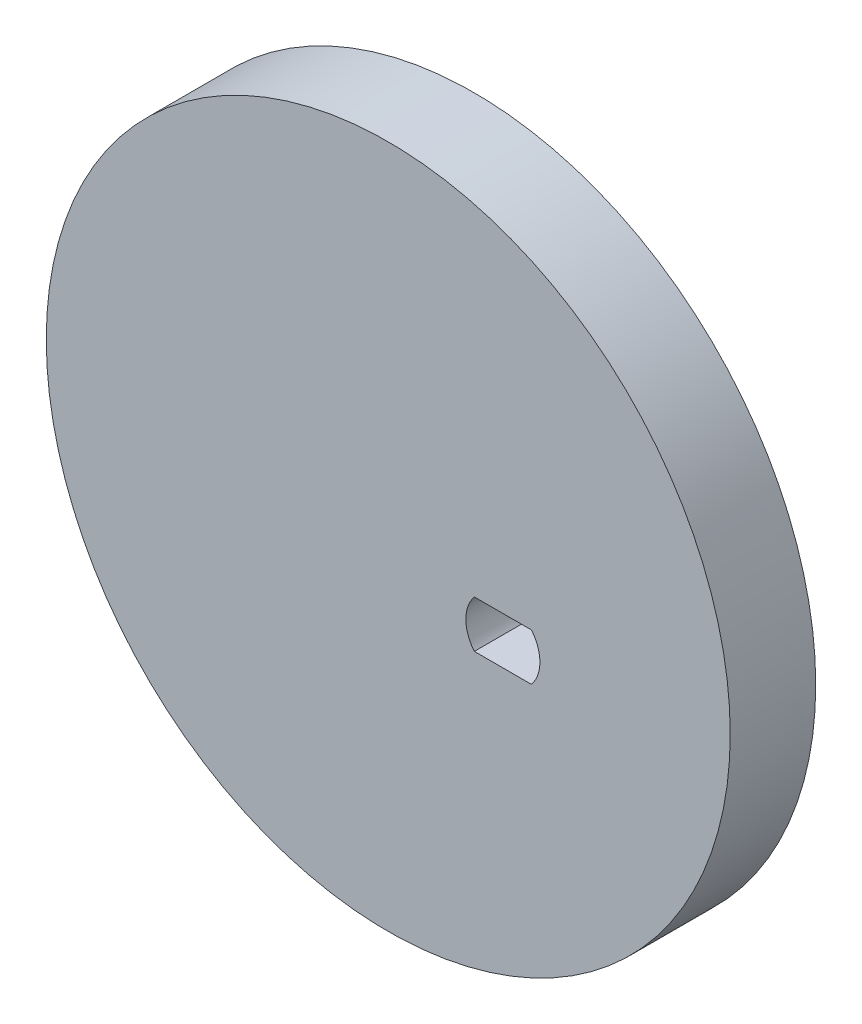
ISO-10303-21;
HEADER;
FILE_DESCRIPTION(('STEP AP214'),'2;1');
FILE_NAME('part.step','',(''),(''),'','','');
FILE_SCHEMA(('AUTOMOTIVE_DESIGN { 1 0 10303 214 1 1 1 1 }'));
ENDSEC;
DATA;
#1=APPLICATION_CONTEXT('core data for automotive mechanical design processes');
#2=APPLICATION_PROTOCOL_DEFINITION('international standard','automotive_design',2000,#1);
#3=PRODUCT_CONTEXT('',#1,'mechanical');
#4=PRODUCT('Part','Part','',(#3));
#5=PRODUCT_RELATED_PRODUCT_CATEGORY('part','',(#4));
#6=PRODUCT_DEFINITION_FORMATION('','',#4);
#7=PRODUCT_DEFINITION_CONTEXT('part definition',#1,'design');
#8=PRODUCT_DEFINITION('design','',#6,#7);
#9=PRODUCT_DEFINITION_SHAPE('','',#8);
#10=(LENGTH_UNIT() NAMED_UNIT(*) SI_UNIT(.MILLI.,.METRE.));
#11=(NAMED_UNIT(*) PLANE_ANGLE_UNIT() SI_UNIT($,.RADIAN.));
#12=(NAMED_UNIT(*) SI_UNIT($,.STERADIAN.) SOLID_ANGLE_UNIT());
#13=UNCERTAINTY_MEASURE_WITH_UNIT(LENGTH_MEASURE(1.E-05),#10,'distance_accuracy_value','');
#14=(GEOMETRIC_REPRESENTATION_CONTEXT(3) GLOBAL_UNCERTAINTY_ASSIGNED_CONTEXT((#13)) GLOBAL_UNIT_ASSIGNED_CONTEXT((#10,
#11,#12)) REPRESENTATION_CONTEXT('',''));
#15=CARTESIAN_POINT('',(0.,0.,0.));
#16=DIRECTION('',(0.,0.,1.));
#17=DIRECTION('',(1.,0.,0.));
#18=AXIS2_PLACEMENT_3D('',#15,#16,#17);
#19=CARTESIAN_POINT('',(-8.51465388188488,2.43047333481311,6.35));
#20=DIRECTION('',(0.,0.,1.));
#21=DIRECTION('',(1.,0.,0.));
#22=AXIS2_PLACEMENT_3D('',#19,#20,#21);
#23=PLANE('',#22);
#24=CARTESIAN_POINT('',(-8.51465388188488,2.43047333481311,6.35));
#25=DIRECTION('',(0.,0.,1.));
#26=DIRECTION('',(1.,0.,0.));
#27=AXIS2_PLACEMENT_3D('',#24,#25,#26);
#28=CIRCLE('',#27,25.4);
#29=CARTESIAN_POINT('',(16.8853461181151,2.43047333481311,6.35));
#30=VERTEX_POINT('',#29);
#31=EDGE_CURVE('E11',#30,#30,#28,.T.);
#32=ORIENTED_EDGE('',*,*,#31,.T.);
#33=EDGE_LOOP('',(#32));
#34=FACE_BOUND('',#33,.T.);
#35=DIRECTION('',(1.,0.,0.));
#36=VECTOR('',#35,1.);
#37=CARTESIAN_POINT('',(-2.12132034355964,-1.75,6.35));
#38=LINE('',#37,#36);
#39=CARTESIAN_POINT('',(-2.12132034355964,-1.75,6.35));
#40=VERTEX_POINT('',#39);
#41=CARTESIAN_POINT('',(2.12132034355964,-1.75,6.35));
#42=VERTEX_POINT('',#41);
#43=EDGE_CURVE('E88',#40,#42,#38,.T.);
#44=ORIENTED_EDGE('',*,*,#43,.F.);
#45=CARTESIAN_POINT('',(0.,0.,6.35));
#46=DIRECTION('',(0.,0.,1.));
#47=DIRECTION('',(1.,0.,0.));
#48=AXIS2_PLACEMENT_3D('',#45,#46,#47);
#49=CIRCLE('',#48,2.75);
#50=CARTESIAN_POINT('',(-2.12132034355964,1.75,6.35));
#51=VERTEX_POINT('',#50);
#52=EDGE_CURVE('E80',#51,#40,#49,.T.);
#53=ORIENTED_EDGE('',*,*,#52,.F.);
#54=DIRECTION('',(-1.,0.,0.));
#55=VECTOR('',#54,1.);
#56=CARTESIAN_POINT('',(-2.12132034355964,1.75,6.35));
#57=LINE('',#56,#55);
#58=CARTESIAN_POINT('',(2.12132034355964,1.75,6.35));
#59=VERTEX_POINT('',#58);
#60=EDGE_CURVE('E101',#59,#51,#57,.T.);
#61=ORIENTED_EDGE('',*,*,#60,.F.);
#62=CARTESIAN_POINT('',(0.,0.,6.35));
#63=DIRECTION('',(0.,0.,1.));
#64=DIRECTION('',(-1.,0.,0.));
#65=AXIS2_PLACEMENT_3D('',#62,#63,#64);
#66=CIRCLE('',#65,2.75);
#67=EDGE_CURVE('E99',#42,#59,#66,.T.);
#68=ORIENTED_EDGE('',*,*,#67,.F.);
#69=EDGE_LOOP('',(#44,#53,#61,#68));
#70=FACE_BOUND('',#69,.T.);
#71=ADVANCED_FACE('F39',(#34,#70),#23,.T.);
#72=CARTESIAN_POINT('',(-8.51465388188488,2.43047333481311,0.));
#73=DIRECTION('',(0.,0.,1.));
#74=DIRECTION('',(1.,0.,0.));
#75=AXIS2_PLACEMENT_3D('',#72,#73,#74);
#76=PLANE('',#75);
#77=CARTESIAN_POINT('',(-8.51465388188488,2.43047333481311,0.));
#78=DIRECTION('',(0.,0.,1.));
#79=DIRECTION('',(1.,0.,0.));
#80=AXIS2_PLACEMENT_3D('',#77,#78,#79);
#81=CIRCLE('',#80,25.4);
#82=CARTESIAN_POINT('',(16.8853461181151,2.43047333481311,0.));
#83=VERTEX_POINT('',#82);
#84=EDGE_CURVE('E43',#83,#83,#81,.T.);
#85=ORIENTED_EDGE('',*,*,#84,.F.);
#86=EDGE_LOOP('',(#85));
#87=FACE_BOUND('',#86,.T.);
#88=CARTESIAN_POINT('',(0.,0.,0.));
#89=DIRECTION('',(0.,0.,1.));
#90=DIRECTION('',(1.,0.,0.));
#91=AXIS2_PLACEMENT_3D('',#88,#89,#90);
#92=CIRCLE('',#91,2.75);
#93=CARTESIAN_POINT('',(-2.12132034355964,1.75,0.));
#94=VERTEX_POINT('',#93);
#95=CARTESIAN_POINT('',(-2.12132034355964,-1.75,0.));
#96=VERTEX_POINT('',#95);
#97=EDGE_CURVE('E62',#94,#96,#92,.T.);
#98=ORIENTED_EDGE('',*,*,#97,.T.);
#99=DIRECTION('',(1.,0.,0.));
#100=VECTOR('',#99,1.);
#101=CARTESIAN_POINT('',(-2.12132034355964,-1.75,0.));
#102=LINE('',#101,#100);
#103=CARTESIAN_POINT('',(2.12132034355964,-1.75,0.));
#104=VERTEX_POINT('',#103);
#105=EDGE_CURVE('E95',#96,#104,#102,.T.);
#106=ORIENTED_EDGE('',*,*,#105,.T.);
#107=CARTESIAN_POINT('',(0.,0.,0.));
#108=DIRECTION('',(0.,0.,1.));
#109=DIRECTION('',(-1.,0.,0.));
#110=AXIS2_PLACEMENT_3D('',#107,#108,#109);
#111=CIRCLE('',#110,2.75);
#112=CARTESIAN_POINT('',(2.12132034355964,1.75,0.));
#113=VERTEX_POINT('',#112);
#114=EDGE_CURVE('E107',#104,#113,#111,.T.);
#115=ORIENTED_EDGE('',*,*,#114,.T.);
#116=DIRECTION('',(-1.,0.,0.));
#117=VECTOR('',#116,1.);
#118=CARTESIAN_POINT('',(-2.12132034355964,1.75,0.));
#119=LINE('',#118,#117);
#120=EDGE_CURVE('E89',#113,#94,#119,.T.);
#121=ORIENTED_EDGE('',*,*,#120,.T.);
#122=EDGE_LOOP('',(#98,#106,#115,#121));
#123=FACE_BOUND('',#122,.T.);
#124=ADVANCED_FACE('F118',(#87,#123),#76,.F.);
#125=CARTESIAN_POINT('',(-8.51465388188488,2.43047333481311,6.35));
#126=DIRECTION('',(0.,0.,-1.));
#127=DIRECTION('',(-1.,0.,0.));
#128=AXIS2_PLACEMENT_3D('',#125,#126,#127);
#129=CYLINDRICAL_SURFACE('',#128,25.4);
#130=ORIENTED_EDGE('',*,*,#31,.F.);
#131=EDGE_LOOP('',(#130));
#132=FACE_BOUND('',#131,.T.);
#133=ORIENTED_EDGE('',*,*,#84,.T.);
#134=EDGE_LOOP('',(#133));
#135=FACE_BOUND('',#134,.T.);
#136=ADVANCED_FACE('F41',(#132,#135),#129,.T.);
#137=CARTESIAN_POINT('',(0.,0.,6.35));
#138=DIRECTION('',(0.,0.,-1.));
#139=DIRECTION('',(-1.,0.,0.));
#140=AXIS2_PLACEMENT_3D('',#137,#138,#139);
#141=CYLINDRICAL_SURFACE('',#140,2.75);
#142=ORIENTED_EDGE('',*,*,#97,.F.);
#143=DIRECTION('',(0.,0.,-1.));
#144=VECTOR('',#143,1.);
#145=CARTESIAN_POINT('',(-2.12132034355964,1.75,6.35));
#146=LINE('',#145,#144);
#147=EDGE_CURVE('E84',#51,#94,#146,.T.);
#148=ORIENTED_EDGE('',*,*,#147,.F.);
#149=ORIENTED_EDGE('',*,*,#52,.T.);
#150=DIRECTION('',(0.,0.,-1.));
#151=VECTOR('',#150,1.);
#152=CARTESIAN_POINT('',(-2.12132034355964,-1.75,6.35));
#153=LINE('',#152,#151);
#154=EDGE_CURVE('E83',#40,#96,#153,.T.);
#155=ORIENTED_EDGE('',*,*,#154,.T.);
#156=EDGE_LOOP('',(#142,#148,#149,#155));
#157=FACE_BOUND('',#156,.T.);
#158=ADVANCED_FACE('F82',(#157),#141,.F.);
#159=CARTESIAN_POINT('',(-2.12132034355964,-1.75,6.35));
#160=DIRECTION('',(0.,1.,0.));
#161=DIRECTION('',(0.,0.,1.));
#162=AXIS2_PLACEMENT_3D('',#159,#160,#161);
#163=PLANE('',#162);
#164=ORIENTED_EDGE('',*,*,#105,.F.);
#165=ORIENTED_EDGE('',*,*,#154,.F.);
#166=ORIENTED_EDGE('',*,*,#43,.T.);
#167=DIRECTION('',(0.,0.,-1.));
#168=VECTOR('',#167,1.);
#169=CARTESIAN_POINT('',(2.12132034355964,-1.75,6.35));
#170=LINE('',#169,#168);
#171=EDGE_CURVE('E96',#42,#104,#170,.T.);
#172=ORIENTED_EDGE('',*,*,#171,.T.);
#173=EDGE_LOOP('',(#164,#165,#166,#172));
#174=FACE_BOUND('',#173,.T.);
#175=ADVANCED_FACE('F92',(#174),#163,.T.);
#176=CARTESIAN_POINT('',(0.,0.,6.35));
#177=DIRECTION('',(0.,0.,-1.));
#178=DIRECTION('',(-1.,0.,0.));
#179=AXIS2_PLACEMENT_3D('',#176,#177,#178);
#180=CYLINDRICAL_SURFACE('',#179,2.75);
#181=ORIENTED_EDGE('',*,*,#114,.F.);
#182=ORIENTED_EDGE('',*,*,#171,.F.);
#183=ORIENTED_EDGE('',*,*,#67,.T.);
#184=DIRECTION('',(0.,0.,-1.));
#185=VECTOR('',#184,1.);
#186=CARTESIAN_POINT('',(2.12132034355964,1.75,6.35));
#187=LINE('',#186,#185);
#188=EDGE_CURVE('E54',#59,#113,#187,.T.);
#189=ORIENTED_EDGE('',*,*,#188,.T.);
#190=EDGE_LOOP('',(#181,#182,#183,#189));
#191=FACE_BOUND('',#190,.T.);
#192=ADVANCED_FACE('F116',(#191),#180,.F.);
#193=CARTESIAN_POINT('',(-2.12132034355964,1.75,6.35));
#194=DIRECTION('',(0.,-1.,0.));
#195=DIRECTION('',(0.,0.,-1.));
#196=AXIS2_PLACEMENT_3D('',#193,#194,#195);
#197=PLANE('',#196);
#198=ORIENTED_EDGE('',*,*,#120,.F.);
#199=ORIENTED_EDGE('',*,*,#188,.F.);
#200=ORIENTED_EDGE('',*,*,#60,.T.);
#201=ORIENTED_EDGE('',*,*,#147,.T.);
#202=EDGE_LOOP('',(#198,#199,#200,#201));
#203=FACE_BOUND('',#202,.T.);
#204=ADVANCED_FACE('F119',(#203),#197,.T.);
#205=CLOSED_SHELL('',(#71,#124,#136,#158,#175,#192,#204));
#206=MANIFOLD_SOLID_BREP('B2',#205);
#207=ADVANCED_BREP_SHAPE_REPRESENTATION('',(#18,#206),#14);
#208=SHAPE_DEFINITION_REPRESENTATION(#9,#207);
ENDSEC;
END-ISO-10303-21;
